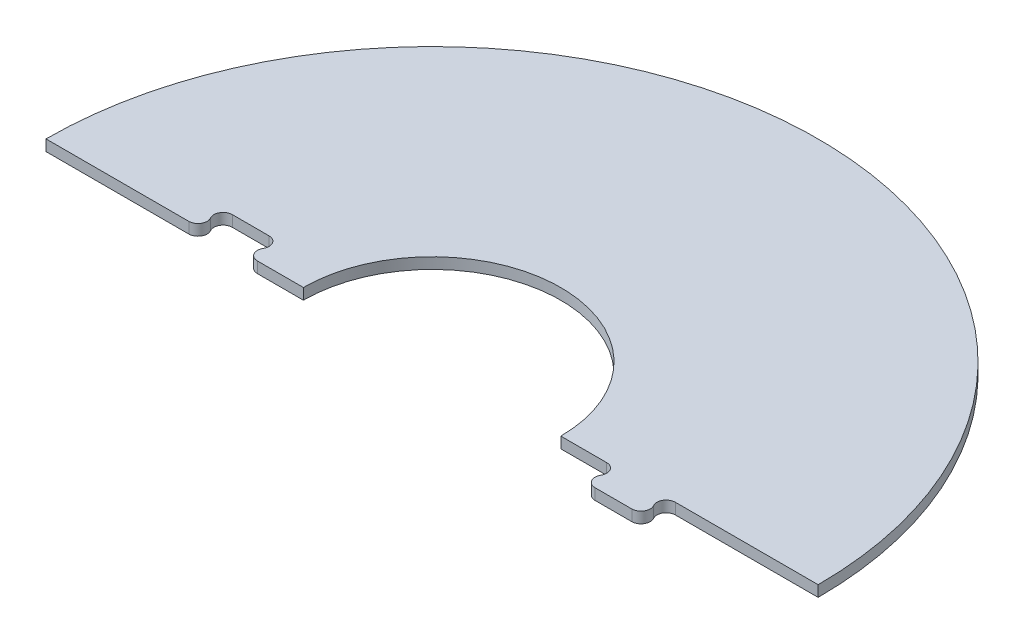
ISO-10303-21;
HEADER;
FILE_DESCRIPTION(('STEP AP214'),'2;1');
FILE_NAME('part.step','',(''),(''),'','','');
FILE_SCHEMA(('AUTOMOTIVE_DESIGN { 1 0 10303 214 1 1 1 1 }'));
ENDSEC;
DATA;
#1=APPLICATION_CONTEXT('core data for automotive mechanical design processes');
#2=APPLICATION_PROTOCOL_DEFINITION('international standard','automotive_design',2000,#1);
#3=PRODUCT_CONTEXT('',#1,'mechanical');
#4=PRODUCT('Part','Part','',(#3));
#5=PRODUCT_RELATED_PRODUCT_CATEGORY('part','',(#4));
#6=PRODUCT_DEFINITION_FORMATION('','',#4);
#7=PRODUCT_DEFINITION_CONTEXT('part definition',#1,'design');
#8=PRODUCT_DEFINITION('design','',#6,#7);
#9=PRODUCT_DEFINITION_SHAPE('','',#8);
#10=(LENGTH_UNIT() NAMED_UNIT(*) SI_UNIT(.MILLI.,.METRE.));
#11=(NAMED_UNIT(*) PLANE_ANGLE_UNIT() SI_UNIT($,.RADIAN.));
#12=(NAMED_UNIT(*) SI_UNIT($,.STERADIAN.) SOLID_ANGLE_UNIT());
#13=UNCERTAINTY_MEASURE_WITH_UNIT(LENGTH_MEASURE(1.E-05),#10,'distance_accuracy_value','');
#14=(GEOMETRIC_REPRESENTATION_CONTEXT(3) GLOBAL_UNCERTAINTY_ASSIGNED_CONTEXT((#13)) GLOBAL_UNIT_ASSIGNED_CONTEXT((#10,
#11,#12)) REPRESENTATION_CONTEXT('',''));
#15=CARTESIAN_POINT('',(0.,0.,0.));
#16=DIRECTION('',(0.,0.,1.));
#17=DIRECTION('',(1.,0.,0.));
#18=AXIS2_PLACEMENT_3D('',#15,#16,#17);
#19=CARTESIAN_POINT('',(0.,12.,0.));
#20=DIRECTION('',(0.,-1.,0.));
#21=DIRECTION('',(0.,0.,-1.));
#22=AXIS2_PLACEMENT_3D('',#19,#20,#21);
#23=CYLINDRICAL_SURFACE('',#22,420.);
#24=CARTESIAN_POINT('',(0.,0.,0.));
#25=DIRECTION('',(0.,1.,0.));
#26=DIRECTION('',(0.,0.,1.));
#27=AXIS2_PLACEMENT_3D('',#24,#25,#26);
#28=CIRCLE('',#27,420.);
#29=CARTESIAN_POINT('',(420.,0.,2.19641969265707E-06));
#30=VERTEX_POINT('',#29);
#31=CARTESIAN_POINT('',(-420.,0.,0.));
#32=VERTEX_POINT('',#31);
#33=EDGE_CURVE('E177',#30,#32,#28,.T.);
#34=ORIENTED_EDGE('',*,*,#33,.T.);
#35=DIRECTION('',(0.,-1.,0.));
#36=VECTOR('',#35,1.);
#37=CARTESIAN_POINT('',(-420.,12.,0.));
#38=LINE('',#37,#36);
#39=CARTESIAN_POINT('',(-420.,12.,0.));
#40=VERTEX_POINT('',#39);
#41=EDGE_CURVE('E11',#40,#32,#38,.T.);
#42=ORIENTED_EDGE('',*,*,#41,.F.);
#43=CARTESIAN_POINT('',(0.,12.,0.));
#44=DIRECTION('',(0.,1.,0.));
#45=DIRECTION('',(0.,0.,1.));
#46=AXIS2_PLACEMENT_3D('',#43,#44,#45);
#47=CIRCLE('',#46,420.);
#48=CARTESIAN_POINT('',(420.,12.,2.19641969265707E-06));
#49=VERTEX_POINT('',#48);
#50=EDGE_CURVE('E207',#49,#40,#47,.T.);
#51=ORIENTED_EDGE('',*,*,#50,.F.);
#52=DIRECTION('',(0.,-1.,0.));
#53=VECTOR('',#52,1.);
#54=CARTESIAN_POINT('',(420.,12.,2.19641969265707E-06));
#55=LINE('',#54,#53);
#56=EDGE_CURVE('E173',#49,#30,#55,.T.);
#57=ORIENTED_EDGE('',*,*,#56,.T.);
#58=EDGE_LOOP('',(#34,#42,#51,#57));
#59=FACE_BOUND('',#58,.T.);
#60=ADVANCED_FACE('F33',(#59),#23,.T.);
#61=CARTESIAN_POINT('',(-420.,12.,0.));
#62=DIRECTION('',(0.,0.,-1.));
#63=DIRECTION('',(-1.,0.,0.));
#64=AXIS2_PLACEMENT_3D('',#61,#62,#63);
#65=PLANE('',#64);
#66=DIRECTION('',(1.,0.,0.));
#67=VECTOR('',#66,1.);
#68=CARTESIAN_POINT('',(-420.,0.,0.));
#69=LINE('',#68,#67);
#70=CARTESIAN_POINT('',(-264.641016151378,0.,0.));
#71=VERTEX_POINT('',#70);
#72=EDGE_CURVE('E180',#32,#71,#69,.T.);
#73=ORIENTED_EDGE('',*,*,#72,.T.);
#74=DIRECTION('',(0.,-1.,0.));
#75=VECTOR('',#74,1.);
#76=CARTESIAN_POINT('',(-264.641016151378,12.,0.));
#77=LINE('',#76,#75);
#78=CARTESIAN_POINT('',(-264.641016151378,12.,0.));
#79=VERTEX_POINT('',#78);
#80=EDGE_CURVE('E41',#79,#71,#77,.T.);
#81=ORIENTED_EDGE('',*,*,#80,.F.);
#82=DIRECTION('',(1.,0.,0.));
#83=VECTOR('',#82,1.);
#84=CARTESIAN_POINT('',(-420.,12.,0.));
#85=LINE('',#84,#83);
#86=EDGE_CURVE('E116',#40,#79,#85,.T.);
#87=ORIENTED_EDGE('',*,*,#86,.F.);
#88=ORIENTED_EDGE('',*,*,#41,.T.);
#89=EDGE_LOOP('',(#73,#81,#87,#88));
#90=FACE_BOUND('',#89,.T.);
#91=ADVANCED_FACE('F305',(#90),#65,.F.);
#92=CARTESIAN_POINT('',(-264.641016151378,12.,-10.));
#93=DIRECTION('',(0.,-1.,0.));
#94=DIRECTION('',(0.,0.,-1.));
#95=AXIS2_PLACEMENT_3D('',#92,#93,#94);
#96=CYLINDRICAL_SURFACE('',#95,10.);
#97=CARTESIAN_POINT('',(-264.641016151378,0.,-10.));
#98=DIRECTION('',(0.,1.,0.));
#99=DIRECTION('',(0.,0.,-1.));
#100=AXIS2_PLACEMENT_3D('',#97,#98,#99);
#101=CIRCLE('',#100,10.);
#102=CARTESIAN_POINT('',(-255.980762113533,0.,-15.));
#103=VERTEX_POINT('',#102);
#104=EDGE_CURVE('E182',#71,#103,#101,.T.);
#105=ORIENTED_EDGE('',*,*,#104,.T.);
#106=DIRECTION('',(0.,-1.,0.));
#107=VECTOR('',#106,1.);
#108=CARTESIAN_POINT('',(-255.980762113533,12.,-15.));
#109=LINE('',#108,#107);
#110=CARTESIAN_POINT('',(-255.980762113533,12.,-15.));
#111=VERTEX_POINT('',#110);
#112=EDGE_CURVE('E238',#111,#103,#109,.T.);
#113=ORIENTED_EDGE('',*,*,#112,.F.);
#114=CARTESIAN_POINT('',(-264.641016151378,12.,-10.));
#115=DIRECTION('',(0.,1.,0.));
#116=DIRECTION('',(0.,0.,-1.));
#117=AXIS2_PLACEMENT_3D('',#114,#115,#116);
#118=CIRCLE('',#117,10.);
#119=EDGE_CURVE('E246',#79,#111,#118,.T.);
#120=ORIENTED_EDGE('',*,*,#119,.F.);
#121=ORIENTED_EDGE('',*,*,#80,.T.);
#122=EDGE_LOOP('',(#105,#113,#120,#121));
#123=FACE_BOUND('',#122,.T.);
#124=ADVANCED_FACE('F244',(#123),#96,.T.);
#125=CARTESIAN_POINT('',(-247.320508075689,12.,-20.));
#126=DIRECTION('',(0.,-1.,0.));
#127=DIRECTION('',(0.,0.,-1.));
#128=AXIS2_PLACEMENT_3D('',#125,#126,#127);
#129=CYLINDRICAL_SURFACE('',#128,9.99999999999998);
#130=CARTESIAN_POINT('',(-247.320508075689,0.,-20.));
#131=DIRECTION('',(0.,-1.,0.));
#132=DIRECTION('',(0.,0.,1.));
#133=AXIS2_PLACEMENT_3D('',#130,#131,#132);
#134=CIRCLE('',#133,9.99999999999998);
#135=CARTESIAN_POINT('',(-247.320508075689,0.,-30.));
#136=VERTEX_POINT('',#135);
#137=EDGE_CURVE('E184',#103,#136,#134,.T.);
#138=ORIENTED_EDGE('',*,*,#137,.T.);
#139=DIRECTION('',(0.,-1.,0.));
#140=VECTOR('',#139,1.);
#141=CARTESIAN_POINT('',(-247.320508075689,12.,-30.));
#142=LINE('',#141,#140);
#143=CARTESIAN_POINT('',(-247.320508075689,12.,-30.));
#144=VERTEX_POINT('',#143);
#145=EDGE_CURVE('E235',#144,#136,#142,.T.);
#146=ORIENTED_EDGE('',*,*,#145,.F.);
#147=CARTESIAN_POINT('',(-247.320508075689,12.,-20.));
#148=DIRECTION('',(0.,-1.,0.));
#149=DIRECTION('',(0.,0.,1.));
#150=AXIS2_PLACEMENT_3D('',#147,#148,#149);
#151=CIRCLE('',#150,9.99999999999998);
#152=EDGE_CURVE('E264',#111,#144,#151,.T.);
#153=ORIENTED_EDGE('',*,*,#152,.F.);
#154=ORIENTED_EDGE('',*,*,#112,.T.);
#155=EDGE_LOOP('',(#138,#146,#153,#154));
#156=FACE_BOUND('',#155,.T.);
#157=ADVANCED_FACE('F255',(#156),#129,.F.);
#158=CARTESIAN_POINT('',(-207.320508075689,12.,-30.));
#159=DIRECTION('',(0.,0.,-1.));
#160=DIRECTION('',(-1.,0.,0.));
#161=AXIS2_PLACEMENT_3D('',#158,#159,#160);
#162=PLANE('',#161);
#163=DIRECTION('',(1.,0.,0.));
#164=VECTOR('',#163,1.);
#165=CARTESIAN_POINT('',(-207.320508075689,0.,-30.));
#166=LINE('',#165,#164);
#167=CARTESIAN_POINT('',(-207.320508075689,0.,-30.));
#168=VERTEX_POINT('',#167);
#169=EDGE_CURVE('E186',#136,#168,#166,.T.);
#170=ORIENTED_EDGE('',*,*,#169,.T.);
#171=DIRECTION('',(0.,-1.,0.));
#172=VECTOR('',#171,1.);
#173=CARTESIAN_POINT('',(-207.320508075689,12.,-30.));
#174=LINE('',#173,#172);
#175=CARTESIAN_POINT('',(-207.320508075689,12.,-30.));
#176=VERTEX_POINT('',#175);
#177=EDGE_CURVE('E232',#176,#168,#174,.T.);
#178=ORIENTED_EDGE('',*,*,#177,.F.);
#179=DIRECTION('',(1.,0.,0.));
#180=VECTOR('',#179,1.);
#181=CARTESIAN_POINT('',(-207.320508075689,12.,-30.));
#182=LINE('',#181,#180);
#183=EDGE_CURVE('E261',#144,#176,#182,.T.);
#184=ORIENTED_EDGE('',*,*,#183,.F.);
#185=ORIENTED_EDGE('',*,*,#145,.T.);
#186=EDGE_LOOP('',(#170,#178,#184,#185));
#187=FACE_BOUND('',#186,.T.);
#188=ADVANCED_FACE('F259',(#187),#162,.F.);
#189=CARTESIAN_POINT('',(-207.320508075689,12.,-20.));
#190=DIRECTION('',(0.,-1.,0.));
#191=DIRECTION('',(0.,0.,-1.));
#192=AXIS2_PLACEMENT_3D('',#189,#190,#191);
#193=CYLINDRICAL_SURFACE('',#192,10.);
#194=CARTESIAN_POINT('',(-207.320508075689,0.,-20.));
#195=DIRECTION('',(0.,-1.,0.));
#196=DIRECTION('',(0.,0.,-1.));
#197=AXIS2_PLACEMENT_3D('',#194,#195,#196);
#198=CIRCLE('',#197,10.);
#199=CARTESIAN_POINT('',(-198.660254037844,0.,-15.));
#200=VERTEX_POINT('',#199);
#201=EDGE_CURVE('E188',#168,#200,#198,.T.);
#202=ORIENTED_EDGE('',*,*,#201,.T.);
#203=DIRECTION('',(0.,-1.,0.));
#204=VECTOR('',#203,1.);
#205=CARTESIAN_POINT('',(-198.660254037844,12.,-15.));
#206=LINE('',#205,#204);
#207=CARTESIAN_POINT('',(-198.660254037844,12.,-15.));
#208=VERTEX_POINT('',#207);
#209=EDGE_CURVE('E229',#208,#200,#206,.T.);
#210=ORIENTED_EDGE('',*,*,#209,.F.);
#211=CARTESIAN_POINT('',(-207.320508075689,12.,-20.));
#212=DIRECTION('',(0.,-1.,0.));
#213=DIRECTION('',(0.,0.,-1.));
#214=AXIS2_PLACEMENT_3D('',#211,#212,#213);
#215=CIRCLE('',#214,10.);
#216=EDGE_CURVE('E263',#176,#208,#215,.T.);
#217=ORIENTED_EDGE('',*,*,#216,.F.);
#218=ORIENTED_EDGE('',*,*,#177,.T.);
#219=EDGE_LOOP('',(#202,#210,#217,#218));
#220=FACE_BOUND('',#219,.T.);
#221=ADVANCED_FACE('F318',(#220),#193,.F.);
#222=CARTESIAN_POINT('',(-190.,12.,-10.));
#223=DIRECTION('',(0.,-1.,0.));
#224=DIRECTION('',(0.,0.,-1.));
#225=AXIS2_PLACEMENT_3D('',#222,#223,#224);
#226=CYLINDRICAL_SURFACE('',#225,10.);
#227=CARTESIAN_POINT('',(-190.,0.,-10.));
#228=DIRECTION('',(0.,1.,0.));
#229=DIRECTION('',(0.,0.,-1.));
#230=AXIS2_PLACEMENT_3D('',#227,#228,#229);
#231=CIRCLE('',#230,10.);
#232=CARTESIAN_POINT('',(-190.,0.,0.));
#233=VERTEX_POINT('',#232);
#234=EDGE_CURVE('E190',#200,#233,#231,.T.);
#235=ORIENTED_EDGE('',*,*,#234,.T.);
#236=DIRECTION('',(0.,-1.,0.));
#237=VECTOR('',#236,1.);
#238=CARTESIAN_POINT('',(-190.,12.,0.));
#239=LINE('',#238,#237);
#240=CARTESIAN_POINT('',(-190.,12.,0.));
#241=VERTEX_POINT('',#240);
#242=EDGE_CURVE('E226',#241,#233,#239,.T.);
#243=ORIENTED_EDGE('',*,*,#242,.F.);
#244=CARTESIAN_POINT('',(-190.,12.,-10.));
#245=DIRECTION('',(0.,1.,0.));
#246=DIRECTION('',(0.,0.,-1.));
#247=AXIS2_PLACEMENT_3D('',#244,#245,#246);
#248=CIRCLE('',#247,10.);
#249=EDGE_CURVE('E266',#208,#241,#248,.T.);
#250=ORIENTED_EDGE('',*,*,#249,.F.);
#251=ORIENTED_EDGE('',*,*,#209,.T.);
#252=EDGE_LOOP('',(#235,#243,#250,#251));
#253=FACE_BOUND('',#252,.T.);
#254=ADVANCED_FACE('F321',(#253),#226,.T.);
#255=CARTESIAN_POINT('',(-190.,12.,0.));
#256=DIRECTION('',(0.,0.,-1.));
#257=DIRECTION('',(-1.,0.,0.));
#258=AXIS2_PLACEMENT_3D('',#255,#256,#257);
#259=PLANE('',#258);
#260=DIRECTION('',(1.,0.,0.));
#261=VECTOR('',#260,1.);
#262=CARTESIAN_POINT('',(-190.,0.,0.));
#263=LINE('',#262,#261);
#264=CARTESIAN_POINT('',(-140.,0.,0.));
#265=VERTEX_POINT('',#264);
#266=EDGE_CURVE('E192',#233,#265,#263,.T.);
#267=ORIENTED_EDGE('',*,*,#266,.T.);
#268=DIRECTION('',(0.,-1.,0.));
#269=VECTOR('',#268,1.);
#270=CARTESIAN_POINT('',(-140.,12.,0.));
#271=LINE('',#270,#269);
#272=CARTESIAN_POINT('',(-140.,12.,0.));
#273=VERTEX_POINT('',#272);
#274=EDGE_CURVE('E223',#273,#265,#271,.T.);
#275=ORIENTED_EDGE('',*,*,#274,.F.);
#276=DIRECTION('',(1.,0.,0.));
#277=VECTOR('',#276,1.);
#278=CARTESIAN_POINT('',(-190.,12.,0.));
#279=LINE('',#278,#277);
#280=EDGE_CURVE('E272',#241,#273,#279,.T.);
#281=ORIENTED_EDGE('',*,*,#280,.F.);
#282=ORIENTED_EDGE('',*,*,#242,.T.);
#283=EDGE_LOOP('',(#267,#275,#281,#282));
#284=FACE_BOUND('',#283,.T.);
#285=ADVANCED_FACE('F325',(#284),#259,.F.);
#286=CARTESIAN_POINT('',(0.,12.,0.));
#287=DIRECTION('',(0.,-1.,0.));
#288=DIRECTION('',(0.,0.,-1.));
#289=AXIS2_PLACEMENT_3D('',#286,#287,#288);
#290=CYLINDRICAL_SURFACE('',#289,140.);
#291=CARTESIAN_POINT('',(0.,0.,0.));
#292=DIRECTION('',(0.,-1.,0.));
#293=DIRECTION('',(0.,0.,1.));
#294=AXIS2_PLACEMENT_3D('',#291,#292,#293);
#295=CIRCLE('',#294,140.);
#296=CARTESIAN_POINT('',(140.,0.,2.13909844029186E-06));
#297=VERTEX_POINT('',#296);
#298=EDGE_CURVE('E194',#265,#297,#295,.T.);
#299=ORIENTED_EDGE('',*,*,#298,.T.);
#300=DIRECTION('',(0.,-1.,0.));
#301=VECTOR('',#300,1.);
#302=CARTESIAN_POINT('',(140.,12.,2.13909844029186E-06));
#303=LINE('',#302,#301);
#304=CARTESIAN_POINT('',(140.,12.,2.13909844029186E-06));
#305=VERTEX_POINT('',#304);
#306=EDGE_CURVE('E220',#305,#297,#303,.T.);
#307=ORIENTED_EDGE('',*,*,#306,.F.);
#308=CARTESIAN_POINT('',(0.,12.,0.));
#309=DIRECTION('',(0.,-1.,0.));
#310=DIRECTION('',(0.,0.,1.));
#311=AXIS2_PLACEMENT_3D('',#308,#309,#310);
#312=CIRCLE('',#311,140.);
#313=EDGE_CURVE('E274',#273,#305,#312,.T.);
#314=ORIENTED_EDGE('',*,*,#313,.F.);
#315=ORIENTED_EDGE('',*,*,#274,.T.);
#316=EDGE_LOOP('',(#299,#307,#314,#315));
#317=FACE_BOUND('',#316,.T.);
#318=ADVANCED_FACE('F329',(#317),#290,.F.);
#319=CARTESIAN_POINT('',(190.,12.,2.14933444157348E-06));
#320=DIRECTION('',(2.04719746806767E-10,0.,-1.));
#321=DIRECTION('',(-1.,0.,-2.04719746806767E-10));
#322=AXIS2_PLACEMENT_3D('',#319,#320,#321);
#323=PLANE('',#322);
#324=DIRECTION('',(1.,0.,2.04719746806767E-10));
#325=VECTOR('',#324,1.);
#326=CARTESIAN_POINT('',(190.,0.,2.14933444157348E-06));
#327=LINE('',#326,#325);
#328=CARTESIAN_POINT('',(190.,0.,2.14933444157348E-06));
#329=VERTEX_POINT('',#328);
#330=EDGE_CURVE('E196',#297,#329,#327,.T.);
#331=ORIENTED_EDGE('',*,*,#330,.T.);
#332=DIRECTION('',(0.,-1.,0.));
#333=VECTOR('',#332,1.);
#334=CARTESIAN_POINT('',(190.,12.,2.14933444157348E-06));
#335=LINE('',#334,#333);
#336=CARTESIAN_POINT('',(190.,12.,2.14933444157348E-06));
#337=VERTEX_POINT('',#336);
#338=EDGE_CURVE('E217',#337,#329,#335,.T.);
#339=ORIENTED_EDGE('',*,*,#338,.F.);
#340=DIRECTION('',(1.,0.,2.04719746806767E-10));
#341=VECTOR('',#340,1.);
#342=CARTESIAN_POINT('',(190.,12.,2.14933444157348E-06));
#343=LINE('',#342,#341);
#344=EDGE_CURVE('E276',#305,#337,#343,.T.);
#345=ORIENTED_EDGE('',*,*,#344,.F.);
#346=ORIENTED_EDGE('',*,*,#306,.T.);
#347=EDGE_LOOP('',(#331,#339,#345,#346));
#348=FACE_BOUND('',#347,.T.);
#349=ADVANCED_FACE('F333',(#348),#323,.F.);
#350=CARTESIAN_POINT('',(189.999999997953,12.,10.0000021493344));
#351=DIRECTION('',(0.,-1.,0.));
#352=DIRECTION('',(0.,0.,-1.));
#353=AXIS2_PLACEMENT_3D('',#350,#351,#352);
#354=CYLINDRICAL_SURFACE('',#353,10.);
#355=CARTESIAN_POINT('',(189.999999997953,0.,10.0000021493344));
#356=DIRECTION('',(0.,-1.,0.));
#357=DIRECTION('',(0.,0.,-1.));
#358=AXIS2_PLACEMENT_3D('',#355,#356,#357);
#359=CIRCLE('',#358,10.);
#360=CARTESIAN_POINT('',(198.660254034774,0.,15.0000021511073));
#361=VERTEX_POINT('',#360);
#362=EDGE_CURVE('E198',#329,#361,#359,.T.);
#363=ORIENTED_EDGE('',*,*,#362,.T.);
#364=DIRECTION('',(0.,-1.,0.));
#365=VECTOR('',#364,1.);
#366=CARTESIAN_POINT('',(198.660254034774,12.,15.0000021511073));
#367=LINE('',#366,#365);
#368=CARTESIAN_POINT('',(198.660254034774,12.,15.0000021511073));
#369=VERTEX_POINT('',#368);
#370=EDGE_CURVE('E214',#369,#361,#367,.T.);
#371=ORIENTED_EDGE('',*,*,#370,.F.);
#372=CARTESIAN_POINT('',(189.999999997953,12.,10.0000021493344));
#373=DIRECTION('',(0.,-1.,0.));
#374=DIRECTION('',(0.,0.,-1.));
#375=AXIS2_PLACEMENT_3D('',#372,#373,#374);
#376=CIRCLE('',#375,10.);
#377=EDGE_CURVE('E278',#337,#369,#376,.T.);
#378=ORIENTED_EDGE('',*,*,#377,.F.);
#379=ORIENTED_EDGE('',*,*,#338,.T.);
#380=EDGE_LOOP('',(#363,#371,#378,#379));
#381=FACE_BOUND('',#380,.T.);
#382=ADVANCED_FACE('F337',(#381),#354,.F.);
#383=CARTESIAN_POINT('',(207.320508071594,12.,20.0000021528802));
#384=DIRECTION('',(0.,-1.,0.));
#385=DIRECTION('',(0.,0.,-1.));
#386=AXIS2_PLACEMENT_3D('',#383,#384,#385);
#387=CYLINDRICAL_SURFACE('',#386,10.);
#388=CARTESIAN_POINT('',(207.320508071594,0.,20.0000021528802));
#389=DIRECTION('',(0.,1.,0.));
#390=DIRECTION('',(0.,0.,-1.));
#391=AXIS2_PLACEMENT_3D('',#388,#389,#390);
#392=CIRCLE('',#391,10.);
#393=CARTESIAN_POINT('',(207.320508069547,0.,30.0000021528803));
#394=VERTEX_POINT('',#393);
#395=EDGE_CURVE('E200',#361,#394,#392,.T.);
#396=ORIENTED_EDGE('',*,*,#395,.T.);
#397=DIRECTION('',(0.,-1.,0.));
#398=VECTOR('',#397,1.);
#399=CARTESIAN_POINT('',(207.320508069547,12.,30.0000021528803));
#400=LINE('',#399,#398);
#401=CARTESIAN_POINT('',(207.320508069547,12.,30.0000021528803));
#402=VERTEX_POINT('',#401);
#403=EDGE_CURVE('E211',#402,#394,#400,.T.);
#404=ORIENTED_EDGE('',*,*,#403,.F.);
#405=CARTESIAN_POINT('',(207.320508071594,12.,20.0000021528802));
#406=DIRECTION('',(0.,1.,0.));
#407=DIRECTION('',(0.,0.,-1.));
#408=AXIS2_PLACEMENT_3D('',#405,#406,#407);
#409=CIRCLE('',#408,10.);
#410=EDGE_CURVE('E280',#369,#402,#409,.T.);
#411=ORIENTED_EDGE('',*,*,#410,.F.);
#412=ORIENTED_EDGE('',*,*,#370,.T.);
#413=EDGE_LOOP('',(#396,#404,#411,#412));
#414=FACE_BOUND('',#413,.T.);
#415=ADVANCED_FACE('F286',(#414),#387,.T.);
#416=CARTESIAN_POINT('',(207.320508069547,12.,30.0000021528803));
#417=DIRECTION('',(2.04718794000192E-10,0.,-1.));
#418=DIRECTION('',(-1.,0.,-2.04718794000192E-10));
#419=AXIS2_PLACEMENT_3D('',#416,#417,#418);
#420=PLANE('',#419);
#421=DIRECTION('',(1.,0.,2.04718794000192E-10));
#422=VECTOR('',#421,1.);
#423=CARTESIAN_POINT('',(207.320508069547,0.,30.0000021528803));
#424=LINE('',#423,#422);
#425=CARTESIAN_POINT('',(247.320508069547,0.,30.000002161069));
#426=VERTEX_POINT('',#425);
#427=EDGE_CURVE('E202',#394,#426,#424,.T.);
#428=ORIENTED_EDGE('',*,*,#427,.T.);
#429=DIRECTION('',(0.,-1.,0.));
#430=VECTOR('',#429,1.);
#431=CARTESIAN_POINT('',(247.320508069547,12.,30.000002161069));
#432=LINE('',#431,#430);
#433=CARTESIAN_POINT('',(247.320508069547,12.,30.000002161069));
#434=VERTEX_POINT('',#433);
#435=EDGE_CURVE('E168',#434,#426,#432,.T.);
#436=ORIENTED_EDGE('',*,*,#435,.F.);
#437=DIRECTION('',(1.,0.,2.04718794000192E-10));
#438=VECTOR('',#437,1.);
#439=CARTESIAN_POINT('',(207.320508069547,12.,30.0000021528803));
#440=LINE('',#439,#438);
#441=EDGE_CURVE('E159',#402,#434,#440,.T.);
#442=ORIENTED_EDGE('',*,*,#441,.F.);
#443=ORIENTED_EDGE('',*,*,#403,.T.);
#444=EDGE_LOOP('',(#428,#436,#442,#443));
#445=FACE_BOUND('',#444,.T.);
#446=ADVANCED_FACE('F290',(#445),#420,.F.);
#447=CARTESIAN_POINT('',(247.320508071594,12.,20.000002161069));
#448=DIRECTION('',(0.,-1.,0.));
#449=DIRECTION('',(0.,0.,-1.));
#450=AXIS2_PLACEMENT_3D('',#447,#448,#449);
#451=CYLINDRICAL_SURFACE('',#450,10.);
#452=CARTESIAN_POINT('',(247.320508071594,0.,20.000002161069));
#453=DIRECTION('',(0.,1.,0.));
#454=DIRECTION('',(0.,0.,1.));
#455=AXIS2_PLACEMENT_3D('',#452,#453,#454);
#456=CIRCLE('',#455,10.);
#457=CARTESIAN_POINT('',(255.980762110463,0.,15.0000021628419));
#458=VERTEX_POINT('',#457);
#459=EDGE_CURVE('E167',#426,#458,#456,.T.);
#460=ORIENTED_EDGE('',*,*,#459,.T.);
#461=DIRECTION('',(0.,-1.,0.));
#462=VECTOR('',#461,1.);
#463=CARTESIAN_POINT('',(255.980762110463,12.,15.0000021628419));
#464=LINE('',#463,#462);
#465=CARTESIAN_POINT('',(255.980762110463,12.,15.0000021628419));
#466=VERTEX_POINT('',#465);
#467=EDGE_CURVE('E164',#466,#458,#464,.T.);
#468=ORIENTED_EDGE('',*,*,#467,.F.);
#469=CARTESIAN_POINT('',(247.320508071594,12.,20.000002161069));
#470=DIRECTION('',(0.,1.,0.));
#471=DIRECTION('',(0.,0.,1.));
#472=AXIS2_PLACEMENT_3D('',#469,#470,#471);
#473=CIRCLE('',#472,10.);
#474=EDGE_CURVE('E153',#434,#466,#473,.T.);
#475=ORIENTED_EDGE('',*,*,#474,.F.);
#476=ORIENTED_EDGE('',*,*,#435,.T.);
#477=EDGE_LOOP('',(#460,#468,#475,#476));
#478=FACE_BOUND('',#477,.T.);
#479=ADVANCED_FACE('F165',(#478),#451,.T.);
#480=CARTESIAN_POINT('',(264.64101614933,12.,10.0000021646148));
#481=DIRECTION('',(0.,-1.,0.));
#482=DIRECTION('',(0.,0.,-1.));
#483=AXIS2_PLACEMENT_3D('',#480,#481,#482);
#484=CYLINDRICAL_SURFACE('',#483,9.99999999999998);
#485=CARTESIAN_POINT('',(264.64101614933,0.,10.0000021646148));
#486=DIRECTION('',(0.,-1.,0.));
#487=DIRECTION('',(0.,0.,-1.));
#488=AXIS2_PLACEMENT_3D('',#485,#486,#487);
#489=CIRCLE('',#488,9.99999999999998);
#490=CARTESIAN_POINT('',(264.641016151378,0.,2.1646148606197E-06));
#491=VERTEX_POINT('',#490);
#492=EDGE_CURVE('E102',#458,#491,#489,.T.);
#493=ORIENTED_EDGE('',*,*,#492,.T.);
#494=DIRECTION('',(0.,-1.,0.));
#495=VECTOR('',#494,1.);
#496=CARTESIAN_POINT('',(264.641016151378,12.,2.1646148606197E-06));
#497=LINE('',#496,#495);
#498=CARTESIAN_POINT('',(264.641016151378,12.,2.1646148606197E-06));
#499=VERTEX_POINT('',#498);
#500=EDGE_CURVE('E169',#499,#491,#497,.T.);
#501=ORIENTED_EDGE('',*,*,#500,.F.);
#502=CARTESIAN_POINT('',(264.64101614933,12.,10.0000021646148));
#503=DIRECTION('',(0.,-1.,0.));
#504=DIRECTION('',(0.,0.,-1.));
#505=AXIS2_PLACEMENT_3D('',#502,#503,#504);
#506=CIRCLE('',#505,9.99999999999998);
#507=EDGE_CURVE('E157',#466,#499,#506,.T.);
#508=ORIENTED_EDGE('',*,*,#507,.F.);
#509=ORIENTED_EDGE('',*,*,#467,.T.);
#510=EDGE_LOOP('',(#493,#501,#508,#509));
#511=FACE_BOUND('',#510,.T.);
#512=ADVANCED_FACE('F171',(#511),#484,.F.);
#513=CARTESIAN_POINT('',(420.,12.,2.19641969265707E-06));
#514=DIRECTION('',(2.04718433056436E-10,0.,-1.));
#515=DIRECTION('',(-1.,0.,-2.04718433056436E-10));
#516=AXIS2_PLACEMENT_3D('',#513,#514,#515);
#517=PLANE('',#516);
#518=DIRECTION('',(1.,0.,2.04718433056436E-10));
#519=VECTOR('',#518,1.);
#520=CARTESIAN_POINT('',(420.,0.,2.19641969265707E-06));
#521=LINE('',#520,#519);
#522=EDGE_CURVE('E108',#491,#30,#521,.T.);
#523=ORIENTED_EDGE('',*,*,#522,.T.);
#524=ORIENTED_EDGE('',*,*,#56,.F.);
#525=DIRECTION('',(1.,0.,2.04718433056436E-10));
#526=VECTOR('',#525,1.);
#527=CARTESIAN_POINT('',(420.,12.,2.19641969265707E-06));
#528=LINE('',#527,#526);
#529=EDGE_CURVE('E49',#499,#49,#528,.T.);
#530=ORIENTED_EDGE('',*,*,#529,.F.);
#531=ORIENTED_EDGE('',*,*,#500,.T.);
#532=EDGE_LOOP('',(#523,#524,#530,#531));
#533=FACE_BOUND('',#532,.T.);
#534=ADVANCED_FACE('F294',(#533),#517,.F.);
#535=CARTESIAN_POINT('',(0.,12.,0.));
#536=DIRECTION('',(0.,1.,0.));
#537=DIRECTION('',(0.,0.,1.));
#538=AXIS2_PLACEMENT_3D('',#535,#536,#537);
#539=PLANE('',#538);
#540=ORIENTED_EDGE('',*,*,#50,.T.);
#541=ORIENTED_EDGE('',*,*,#86,.T.);
#542=ORIENTED_EDGE('',*,*,#119,.T.);
#543=ORIENTED_EDGE('',*,*,#152,.T.);
#544=ORIENTED_EDGE('',*,*,#183,.T.);
#545=ORIENTED_EDGE('',*,*,#216,.T.);
#546=ORIENTED_EDGE('',*,*,#249,.T.);
#547=ORIENTED_EDGE('',*,*,#280,.T.);
#548=ORIENTED_EDGE('',*,*,#313,.T.);
#549=ORIENTED_EDGE('',*,*,#344,.T.);
#550=ORIENTED_EDGE('',*,*,#377,.T.);
#551=ORIENTED_EDGE('',*,*,#410,.T.);
#552=ORIENTED_EDGE('',*,*,#441,.T.);
#553=ORIENTED_EDGE('',*,*,#474,.T.);
#554=ORIENTED_EDGE('',*,*,#507,.T.);
#555=ORIENTED_EDGE('',*,*,#529,.T.);
#556=EDGE_LOOP('',(#540,#541,#542,#543,#544,#545,#546,#547,#548,#549,#550,#551,#552,#553,#554,#555));
#557=FACE_BOUND('',#556,.T.);
#558=ADVANCED_FACE('F155',(#557),#539,.T.);
#559=CARTESIAN_POINT('',(0.,0.,0.));
#560=DIRECTION('',(0.,1.,0.));
#561=DIRECTION('',(0.,0.,1.));
#562=AXIS2_PLACEMENT_3D('',#559,#560,#561);
#563=PLANE('',#562);
#564=ORIENTED_EDGE('',*,*,#33,.F.);
#565=ORIENTED_EDGE('',*,*,#522,.F.);
#566=ORIENTED_EDGE('',*,*,#492,.F.);
#567=ORIENTED_EDGE('',*,*,#459,.F.);
#568=ORIENTED_EDGE('',*,*,#427,.F.);
#569=ORIENTED_EDGE('',*,*,#395,.F.);
#570=ORIENTED_EDGE('',*,*,#362,.F.);
#571=ORIENTED_EDGE('',*,*,#330,.F.);
#572=ORIENTED_EDGE('',*,*,#298,.F.);
#573=ORIENTED_EDGE('',*,*,#266,.F.);
#574=ORIENTED_EDGE('',*,*,#234,.F.);
#575=ORIENTED_EDGE('',*,*,#201,.F.);
#576=ORIENTED_EDGE('',*,*,#169,.F.);
#577=ORIENTED_EDGE('',*,*,#137,.F.);
#578=ORIENTED_EDGE('',*,*,#104,.F.);
#579=ORIENTED_EDGE('',*,*,#72,.F.);
#580=EDGE_LOOP('',(#564,#565,#566,#567,#568,#569,#570,#571,#572,#573,#574,#575,#576,#577,#578,#579));
#581=FACE_BOUND('',#580,.T.);
#582=ADVANCED_FACE('F250',(#581),#563,.F.);
#583=CLOSED_SHELL('',(#60,#91,#124,#157,#188,#221,#254,#285,#318,#349,#382,#415,#446,#479,#512,
#534,#558,#582));
#584=MANIFOLD_SOLID_BREP('B2',#583);
#585=ADVANCED_BREP_SHAPE_REPRESENTATION('',(#18,#584),#14);
#586=SHAPE_DEFINITION_REPRESENTATION(#9,#585);
ENDSEC;
END-ISO-10303-21;
